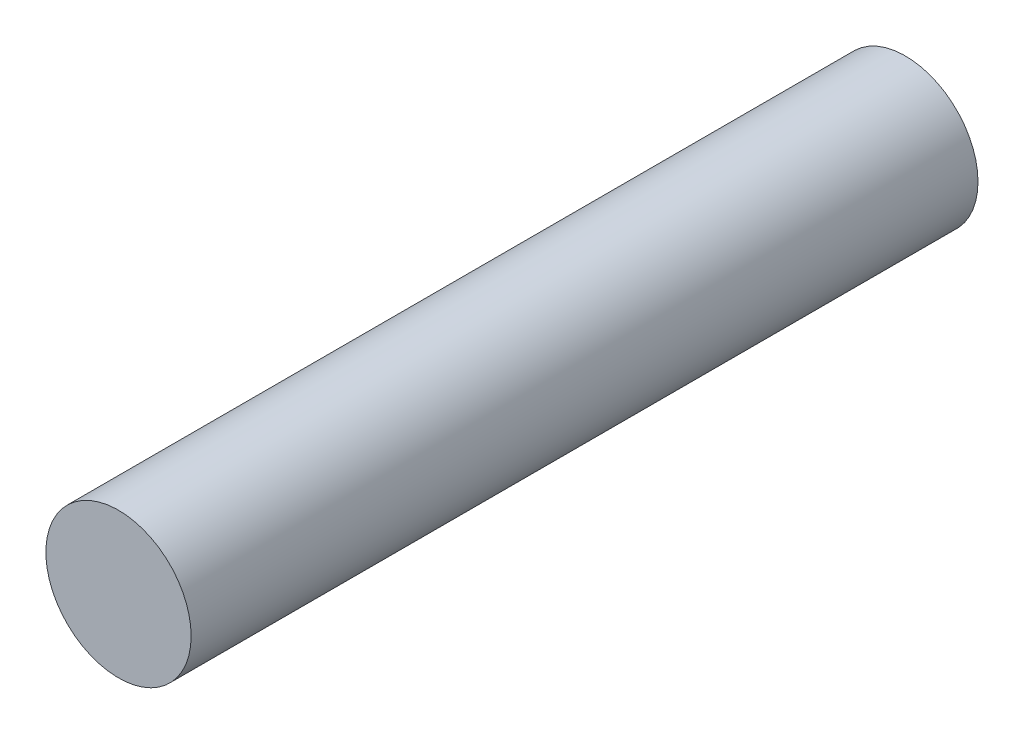
ISO-10303-21;
HEADER;
FILE_DESCRIPTION(('STEP AP214'),'2;1');
FILE_NAME('part.step','',(''),(''),'','','');
FILE_SCHEMA(('AUTOMOTIVE_DESIGN { 1 0 10303 214 1 1 1 1 }'));
ENDSEC;
DATA;
#1=APPLICATION_CONTEXT('core data for automotive mechanical design processes');
#2=APPLICATION_PROTOCOL_DEFINITION('international standard','automotive_design',2000,#1);
#3=PRODUCT_CONTEXT('',#1,'mechanical');
#4=PRODUCT('Part','Part','',(#3));
#5=PRODUCT_RELATED_PRODUCT_CATEGORY('part','',(#4));
#6=PRODUCT_DEFINITION_FORMATION('','',#4);
#7=PRODUCT_DEFINITION_CONTEXT('part definition',#1,'design');
#8=PRODUCT_DEFINITION('design','',#6,#7);
#9=PRODUCT_DEFINITION_SHAPE('','',#8);
#10=(LENGTH_UNIT() NAMED_UNIT(*) SI_UNIT(.MILLI.,.METRE.));
#11=(NAMED_UNIT(*) PLANE_ANGLE_UNIT() SI_UNIT($,.RADIAN.));
#12=(NAMED_UNIT(*) SI_UNIT($,.STERADIAN.) SOLID_ANGLE_UNIT());
#13=UNCERTAINTY_MEASURE_WITH_UNIT(LENGTH_MEASURE(1.E-05),#10,'distance_accuracy_value','');
#14=(GEOMETRIC_REPRESENTATION_CONTEXT(3) GLOBAL_UNCERTAINTY_ASSIGNED_CONTEXT((#13)) GLOBAL_UNIT_ASSIGNED_CONTEXT((#10,
#11,#12)) REPRESENTATION_CONTEXT('',''));
#15=CARTESIAN_POINT('',(0.,0.,0.));
#16=DIRECTION('',(0.,0.,1.));
#17=DIRECTION('',(1.,0.,0.));
#18=AXIS2_PLACEMENT_3D('',#15,#16,#17);
#19=CARTESIAN_POINT('',(0.,0.,65.));
#20=DIRECTION('',(0.,0.,-1.));
#21=DIRECTION('',(-1.,0.,0.));
#22=AXIS2_PLACEMENT_3D('',#19,#20,#21);
#23=CYLINDRICAL_SURFACE('',#22,6.);
#24=CARTESIAN_POINT('',(0.,0.,65.));
#25=DIRECTION('',(0.,0.,1.));
#26=DIRECTION('',(1.,0.,0.));
#27=AXIS2_PLACEMENT_3D('',#24,#25,#26);
#28=CIRCLE('',#27,6.);
#29=CARTESIAN_POINT('',(6.,0.,65.));
#30=VERTEX_POINT('',#29);
#31=EDGE_CURVE('E10',#30,#30,#28,.T.);
#32=ORIENTED_EDGE('',*,*,#31,.F.);
#33=EDGE_LOOP('',(#32));
#34=FACE_BOUND('',#33,.T.);
#35=CARTESIAN_POINT('',(0.,0.,0.));
#36=DIRECTION('',(0.,0.,1.));
#37=DIRECTION('',(1.,0.,0.));
#38=AXIS2_PLACEMENT_3D('',#35,#36,#37);
#39=CIRCLE('',#38,6.);
#40=CARTESIAN_POINT('',(6.,0.,0.));
#41=VERTEX_POINT('',#40);
#42=EDGE_CURVE('E35',#41,#41,#39,.T.);
#43=ORIENTED_EDGE('',*,*,#42,.T.);
#44=EDGE_LOOP('',(#43));
#45=FACE_BOUND('',#44,.T.);
#46=ADVANCED_FACE('F32',(#34,#45),#23,.T.);
#47=CARTESIAN_POINT('',(0.,0.,65.));
#48=DIRECTION('',(0.,0.,1.));
#49=DIRECTION('',(1.,0.,0.));
#50=AXIS2_PLACEMENT_3D('',#47,#48,#49);
#51=PLANE('',#50);
#52=ORIENTED_EDGE('',*,*,#31,.T.);
#53=EDGE_LOOP('',(#52));
#54=FACE_BOUND('',#53,.T.);
#55=ADVANCED_FACE('F47',(#54),#51,.T.);
#56=CARTESIAN_POINT('',(0.,0.,0.));
#57=DIRECTION('',(0.,0.,1.));
#58=DIRECTION('',(1.,0.,0.));
#59=AXIS2_PLACEMENT_3D('',#56,#57,#58);
#60=PLANE('',#59);
#61=ORIENTED_EDGE('',*,*,#42,.F.);
#62=EDGE_LOOP('',(#61));
#63=FACE_BOUND('',#62,.T.);
#64=ADVANCED_FACE('F45',(#63),#60,.F.);
#65=CLOSED_SHELL('',(#46,#55,#64));
#66=MANIFOLD_SOLID_BREP('B2',#65);
#67=ADVANCED_BREP_SHAPE_REPRESENTATION('',(#18,#66),#14);
#68=SHAPE_DEFINITION_REPRESENTATION(#9,#67);
ENDSEC;
END-ISO-10303-21;
